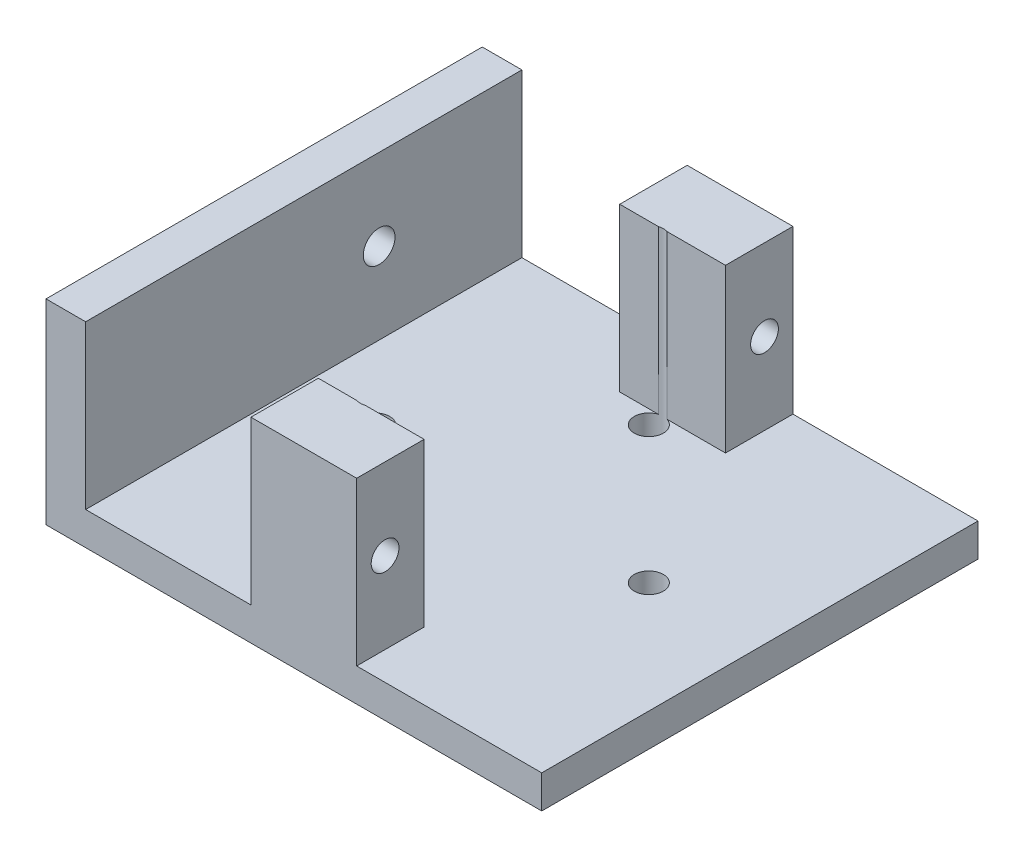
ISO-10303-21;
HEADER;
FILE_DESCRIPTION(('STEP AP214'),'2;1');
FILE_NAME('part.step','',(''),(''),'','','');
FILE_SCHEMA(('AUTOMOTIVE_DESIGN { 1 0 10303 214 1 1 1 1 }'));
ENDSEC;
DATA;
#1=APPLICATION_CONTEXT('core data for automotive mechanical design processes');
#2=APPLICATION_PROTOCOL_DEFINITION('international standard','automotive_design',2000,#1);
#3=PRODUCT_CONTEXT('',#1,'mechanical');
#4=PRODUCT('Part','Part','',(#3));
#5=PRODUCT_RELATED_PRODUCT_CATEGORY('part','',(#4));
#6=PRODUCT_DEFINITION_FORMATION('','',#4);
#7=PRODUCT_DEFINITION_CONTEXT('part definition',#1,'design');
#8=PRODUCT_DEFINITION('design','',#6,#7);
#9=PRODUCT_DEFINITION_SHAPE('','',#8);
#10=(LENGTH_UNIT() NAMED_UNIT(*) SI_UNIT(.MILLI.,.METRE.));
#11=(NAMED_UNIT(*) PLANE_ANGLE_UNIT() SI_UNIT($,.RADIAN.));
#12=(NAMED_UNIT(*) SI_UNIT($,.STERADIAN.) SOLID_ANGLE_UNIT());
#13=UNCERTAINTY_MEASURE_WITH_UNIT(LENGTH_MEASURE(1.E-05),#10,'distance_accuracy_value','');
#14=(GEOMETRIC_REPRESENTATION_CONTEXT(3) GLOBAL_UNCERTAINTY_ASSIGNED_CONTEXT((#13)) GLOBAL_UNIT_ASSIGNED_CONTEXT((#10,
#11,#12)) REPRESENTATION_CONTEXT('',''));
#15=CARTESIAN_POINT('',(0.,0.,0.));
#16=DIRECTION('',(0.,0.,1.));
#17=DIRECTION('',(1.,0.,0.));
#18=AXIS2_PLACEMENT_3D('',#15,#16,#17);
#19=CARTESIAN_POINT('',(4.75000000000001,14.8,11.4));
#20=DIRECTION('',(0.,0.,1.));
#21=DIRECTION('',(1.,0.,0.));
#22=AXIS2_PLACEMENT_3D('',#19,#20,#21);
#23=PLANE('',#22);
#24=DIRECTION('',(-1.,0.,0.));
#25=VECTOR('',#24,1.);
#26=CARTESIAN_POINT('',(4.75000000000001,14.8,11.4));
#27=LINE('',#26,#25);
#28=CARTESIAN_POINT('',(-0.327871926215106,14.8,11.4));
#29=VERTEX_POINT('',#28);
#30=CARTESIAN_POINT('',(-3.24999999999999,14.8,11.4));
#31=VERTEX_POINT('',#30);
#32=EDGE_CURVE('E247',#29,#31,#27,.T.);
#33=ORIENTED_EDGE('',*,*,#32,.F.);
#34=DIRECTION('',(0.,-1.,0.));
#35=VECTOR('',#34,1.);
#36=CARTESIAN_POINT('',(-0.327871926215104,14.8,11.4));
#37=LINE('',#36,#35);
#38=CARTESIAN_POINT('',(-0.327871926215106,2.5,11.4));
#39=VERTEX_POINT('',#38);
#40=EDGE_CURVE('E63',#29,#39,#37,.T.);
#41=ORIENTED_EDGE('',*,*,#40,.T.);
#42=DIRECTION('',(-1.,0.,0.));
#43=VECTOR('',#42,1.);
#44=CARTESIAN_POINT('',(4.75000000000001,2.5,11.4));
#45=LINE('',#44,#43);
#46=CARTESIAN_POINT('',(-3.24999999999999,2.5,11.4));
#47=VERTEX_POINT('',#46);
#48=EDGE_CURVE('E231',#39,#47,#45,.T.);
#49=ORIENTED_EDGE('',*,*,#48,.T.);
#50=DIRECTION('',(0.,-1.,0.));
#51=VECTOR('',#50,1.);
#52=CARTESIAN_POINT('',(-3.24999999999999,14.8,11.4));
#53=LINE('',#52,#51);
#54=EDGE_CURVE('E214',#31,#47,#53,.T.);
#55=ORIENTED_EDGE('',*,*,#54,.F.);
#56=EDGE_LOOP('',(#33,#41,#49,#55));
#57=FACE_BOUND('',#56,.T.);
#58=ADVANCED_FACE('F45',(#57),#23,.F.);
#59=CARTESIAN_POINT('',(4.75000000000001,14.8,-11.4));
#60=DIRECTION('',(0.,0.,-1.));
#61=DIRECTION('',(-1.,0.,0.));
#62=AXIS2_PLACEMENT_3D('',#59,#60,#61);
#63=PLANE('',#62);
#64=DIRECTION('',(1.,0.,0.));
#65=VECTOR('',#64,1.);
#66=CARTESIAN_POINT('',(4.75000000000001,14.8,-11.4));
#67=LINE('',#66,#65);
#68=CARTESIAN_POINT('',(0.32787192621509,14.8,-11.4));
#69=VERTEX_POINT('',#68);
#70=CARTESIAN_POINT('',(4.75000000000001,14.8,-11.4));
#71=VERTEX_POINT('',#70);
#72=EDGE_CURVE('E192',#69,#71,#67,.T.);
#73=ORIENTED_EDGE('',*,*,#72,.F.);
#74=DIRECTION('',(0.,-1.,0.));
#75=VECTOR('',#74,1.);
#76=CARTESIAN_POINT('',(0.327871926215092,14.8,-11.4));
#77=LINE('',#76,#75);
#78=CARTESIAN_POINT('',(0.32787192621509,2.5,-11.4));
#79=VERTEX_POINT('',#78);
#80=EDGE_CURVE('E71',#69,#79,#77,.T.);
#81=ORIENTED_EDGE('',*,*,#80,.T.);
#82=DIRECTION('',(1.,0.,0.));
#83=VECTOR('',#82,1.);
#84=CARTESIAN_POINT('',(4.75000000000001,2.5,-11.4));
#85=LINE('',#84,#83);
#86=CARTESIAN_POINT('',(4.75000000000001,2.5,-11.4));
#87=VERTEX_POINT('',#86);
#88=EDGE_CURVE('E209',#79,#87,#85,.T.);
#89=ORIENTED_EDGE('',*,*,#88,.T.);
#90=DIRECTION('',(0.,-1.,0.));
#91=VECTOR('',#90,1.);
#92=CARTESIAN_POINT('',(4.75000000000001,14.8,-11.4));
#93=LINE('',#92,#91);
#94=EDGE_CURVE('E198',#71,#87,#93,.T.);
#95=ORIENTED_EDGE('',*,*,#94,.F.);
#96=EDGE_LOOP('',(#73,#81,#89,#95));
#97=FACE_BOUND('',#96,.T.);
#98=ADVANCED_FACE('F423',(#97),#63,.F.);
#99=CARTESIAN_POINT('',(0.,2.5,0.));
#100=DIRECTION('',(0.,-1.,0.));
#101=DIRECTION('',(0.,0.,-1.));
#102=AXIS2_PLACEMENT_3D('',#99,#100,#101);
#103=PLANE('',#102);
#104=CARTESIAN_POINT('',(-10.35,2.5,0.));
#105=DIRECTION('',(0.,-1.,0.));
#106=DIRECTION('',(0.,0.,-1.));
#107=AXIS2_PLACEMENT_3D('',#104,#105,#106);
#108=CIRCLE('',#107,1.1);
#109=CARTESIAN_POINT('',(-10.35,2.5,-1.1));
#110=VERTEX_POINT('',#109);
#111=EDGE_CURVE('E381',#110,#110,#108,.T.);
#112=ORIENTED_EDGE('',*,*,#111,.T.);
#113=EDGE_LOOP('',(#112));
#114=FACE_BOUND('',#113,.T.);
#115=CARTESIAN_POINT('',(10.35,2.5,0.));
#116=DIRECTION('',(0.,-1.,0.));
#117=DIRECTION('',(0.,0.,-1.));
#118=AXIS2_PLACEMENT_3D('',#115,#116,#117);
#119=CIRCLE('',#118,1.1);
#120=CARTESIAN_POINT('',(10.35,2.5,-1.1));
#121=VERTEX_POINT('',#120);
#122=EDGE_CURVE('E377',#121,#121,#119,.T.);
#123=ORIENTED_EDGE('',*,*,#122,.T.);
#124=EDGE_LOOP('',(#123));
#125=FACE_BOUND('',#124,.T.);
#126=ORIENTED_EDGE('',*,*,#48,.F.);
#127=CARTESIAN_POINT('',(0.,2.5,10.35));
#128=DIRECTION('',(0.,-1.,0.));
#129=DIRECTION('',(0.,0.,-1.));
#130=AXIS2_PLACEMENT_3D('',#127,#128,#129);
#131=CIRCLE('',#130,1.1);
#132=CARTESIAN_POINT('',(0.327871926215104,2.5,11.4));
#133=VERTEX_POINT('',#132);
#134=EDGE_CURVE('E371',#39,#133,#131,.T.);
#135=ORIENTED_EDGE('',*,*,#134,.T.);
#136=CARTESIAN_POINT('',(4.75000000000001,2.5,11.4));
#137=VERTEX_POINT('',#136);
#138=EDGE_CURVE('E233',#137,#133,#45,.T.);
#139=ORIENTED_EDGE('',*,*,#138,.F.);
#140=DIRECTION('',(0.,0.,-1.));
#141=VECTOR('',#140,1.);
#142=CARTESIAN_POINT('',(4.75000000000001,2.5,16.5));
#143=LINE('',#142,#141);
#144=CARTESIAN_POINT('',(4.75000000000001,2.5,16.5));
#145=VERTEX_POINT('',#144);
#146=EDGE_CURVE('E237',#145,#137,#143,.T.);
#147=ORIENTED_EDGE('',*,*,#146,.F.);
#148=DIRECTION('',(1.,0.,0.));
#149=VECTOR('',#148,1.);
#150=CARTESIAN_POINT('',(-18.75,2.5,16.5));
#151=LINE('',#150,#149);
#152=CARTESIAN_POINT('',(18.75,2.5,16.5));
#153=VERTEX_POINT('',#152);
#154=EDGE_CURVE('E290',#145,#153,#151,.T.);
#155=ORIENTED_EDGE('',*,*,#154,.T.);
#156=DIRECTION('',(0.,0.,-1.));
#157=VECTOR('',#156,1.);
#158=CARTESIAN_POINT('',(18.75,2.5,16.5));
#159=LINE('',#158,#157);
#160=CARTESIAN_POINT('',(18.75,2.5,-16.5));
#161=VERTEX_POINT('',#160);
#162=EDGE_CURVE('E281',#153,#161,#159,.T.);
#163=ORIENTED_EDGE('',*,*,#162,.T.);
#164=DIRECTION('',(-1.,0.,0.));
#165=VECTOR('',#164,1.);
#166=CARTESIAN_POINT('',(-18.75,2.5,-16.5));
#167=LINE('',#166,#165);
#168=CARTESIAN_POINT('',(4.75,2.5,-16.5));
#169=VERTEX_POINT('',#168);
#170=EDGE_CURVE('E287',#161,#169,#167,.T.);
#171=ORIENTED_EDGE('',*,*,#170,.T.);
#172=DIRECTION('',(0.,0.,-1.));
#173=VECTOR('',#172,1.);
#174=CARTESIAN_POINT('',(4.75,2.5,-16.5));
#175=LINE('',#174,#173);
#176=EDGE_CURVE('E200',#87,#169,#175,.T.);
#177=ORIENTED_EDGE('',*,*,#176,.F.);
#178=ORIENTED_EDGE('',*,*,#88,.F.);
#179=CARTESIAN_POINT('',(0.,2.5,-10.35));
#180=DIRECTION('',(0.,-1.,0.));
#181=DIRECTION('',(0.,0.,-1.));
#182=AXIS2_PLACEMENT_3D('',#179,#180,#181);
#183=CIRCLE('',#182,1.1);
#184=CARTESIAN_POINT('',(-0.327871926215093,2.5,-11.4));
#185=VERTEX_POINT('',#184);
#186=EDGE_CURVE('E184',#79,#185,#183,.T.);
#187=ORIENTED_EDGE('',*,*,#186,.T.);
#188=CARTESIAN_POINT('',(-3.25,2.5,-11.4));
#189=VERTEX_POINT('',#188);
#190=EDGE_CURVE('E182',#189,#185,#85,.T.);
#191=ORIENTED_EDGE('',*,*,#190,.F.);
#192=DIRECTION('',(0.,0.,1.));
#193=VECTOR('',#192,1.);
#194=CARTESIAN_POINT('',(-3.25,2.5,-16.5));
#195=LINE('',#194,#193);
#196=CARTESIAN_POINT('',(-3.25,2.5,-16.5));
#197=VERTEX_POINT('',#196);
#198=EDGE_CURVE('E400',#197,#189,#195,.T.);
#199=ORIENTED_EDGE('',*,*,#198,.F.);
#200=CARTESIAN_POINT('',(-15.75,2.5,-16.5));
#201=VERTEX_POINT('',#200);
#202=EDGE_CURVE('E285',#197,#201,#167,.T.);
#203=ORIENTED_EDGE('',*,*,#202,.T.);
#204=DIRECTION('',(0.,0.,-1.));
#205=VECTOR('',#204,1.);
#206=CARTESIAN_POINT('',(-15.75,2.5,-16.5));
#207=LINE('',#206,#205);
#208=CARTESIAN_POINT('',(-15.75,2.5,16.5));
#209=VERTEX_POINT('',#208);
#210=EDGE_CURVE('E241',#209,#201,#207,.T.);
#211=ORIENTED_EDGE('',*,*,#210,.F.);
#212=CARTESIAN_POINT('',(-3.24999999999999,2.5,16.5));
#213=VERTEX_POINT('',#212);
#214=EDGE_CURVE('E291',#209,#213,#151,.T.);
#215=ORIENTED_EDGE('',*,*,#214,.T.);
#216=DIRECTION('',(0.,0.,1.));
#217=VECTOR('',#216,1.);
#218=CARTESIAN_POINT('',(-3.24999999999999,2.5,16.5));
#219=LINE('',#218,#217);
#220=EDGE_CURVE('E227',#47,#213,#219,.T.);
#221=ORIENTED_EDGE('',*,*,#220,.F.);
#222=EDGE_LOOP('',(#126,#135,#139,#147,#155,#163,#171,#177,#178,#187,#191,#199,#203,#211,#215,#221));
#223=FACE_BOUND('',#222,.T.);
#224=ADVANCED_FACE('F416',(#114,#125,#223),#103,.F.);
#225=CARTESIAN_POINT('',(18.75,2.5,16.5));
#226=DIRECTION('',(-1.,0.,0.));
#227=DIRECTION('',(0.,0.,1.));
#228=AXIS2_PLACEMENT_3D('',#225,#226,#227);
#229=PLANE('',#228);
#230=DIRECTION('',(0.,0.,-1.));
#231=VECTOR('',#230,1.);
#232=CARTESIAN_POINT('',(18.75,0.,16.5));
#233=LINE('',#232,#231);
#234=CARTESIAN_POINT('',(18.75,0.,16.5));
#235=VERTEX_POINT('',#234);
#236=CARTESIAN_POINT('',(18.75,0.,-16.5));
#237=VERTEX_POINT('',#236);
#238=EDGE_CURVE('E280',#235,#237,#233,.T.);
#239=ORIENTED_EDGE('',*,*,#238,.T.);
#240=DIRECTION('',(0.,-1.,0.));
#241=VECTOR('',#240,1.);
#242=CARTESIAN_POINT('',(18.75,2.5,-16.5));
#243=LINE('',#242,#241);
#244=EDGE_CURVE('E55',#161,#237,#243,.T.);
#245=ORIENTED_EDGE('',*,*,#244,.F.);
#246=ORIENTED_EDGE('',*,*,#162,.F.);
#247=DIRECTION('',(0.,-1.,0.));
#248=VECTOR('',#247,1.);
#249=CARTESIAN_POINT('',(18.75,2.5,16.5));
#250=LINE('',#249,#248);
#251=EDGE_CURVE('E294',#153,#235,#250,.T.);
#252=ORIENTED_EDGE('',*,*,#251,.T.);
#253=EDGE_LOOP('',(#239,#245,#246,#252));
#254=FACE_BOUND('',#253,.T.);
#255=ADVANCED_FACE('F47',(#254),#229,.F.);
#256=CARTESIAN_POINT('',(-18.75,2.5,-16.5));
#257=DIRECTION('',(0.,0.,1.));
#258=DIRECTION('',(1.,0.,0.));
#259=AXIS2_PLACEMENT_3D('',#256,#257,#258);
#260=PLANE('',#259);
#261=DIRECTION('',(-1.,0.,0.));
#262=VECTOR('',#261,1.);
#263=CARTESIAN_POINT('',(-18.75,0.,-16.5));
#264=LINE('',#263,#262);
#265=CARTESIAN_POINT('',(-18.75,0.,-16.5));
#266=VERTEX_POINT('',#265);
#267=EDGE_CURVE('E298',#237,#266,#264,.T.);
#268=ORIENTED_EDGE('',*,*,#267,.T.);
#269=DIRECTION('',(0.,-1.,0.));
#270=VECTOR('',#269,1.);
#271=CARTESIAN_POINT('',(-18.75,2.5,-16.5));
#272=LINE('',#271,#270);
#273=CARTESIAN_POINT('',(-18.75,14.8,-16.5));
#274=VERTEX_POINT('',#273);
#275=EDGE_CURVE('E313',#274,#266,#272,.T.);
#276=ORIENTED_EDGE('',*,*,#275,.F.);
#277=DIRECTION('',(-1.,0.,0.));
#278=VECTOR('',#277,1.);
#279=CARTESIAN_POINT('',(-18.75,14.8,-16.5));
#280=LINE('',#279,#278);
#281=CARTESIAN_POINT('',(-15.75,14.8,-16.5));
#282=VERTEX_POINT('',#281);
#283=EDGE_CURVE('E265',#282,#274,#280,.T.);
#284=ORIENTED_EDGE('',*,*,#283,.F.);
#285=DIRECTION('',(0.,-1.,0.));
#286=VECTOR('',#285,1.);
#287=CARTESIAN_POINT('',(-15.75,14.8,-16.5));
#288=LINE('',#287,#286);
#289=EDGE_CURVE('E269',#282,#201,#288,.T.);
#290=ORIENTED_EDGE('',*,*,#289,.T.);
#291=ORIENTED_EDGE('',*,*,#202,.F.);
#292=DIRECTION('',(0.,-1.,0.));
#293=VECTOR('',#292,1.);
#294=CARTESIAN_POINT('',(-3.25,14.8,-16.5));
#295=LINE('',#294,#293);
#296=CARTESIAN_POINT('',(-3.25,14.8,-16.5));
#297=VERTEX_POINT('',#296);
#298=EDGE_CURVE('E389',#297,#197,#295,.T.);
#299=ORIENTED_EDGE('',*,*,#298,.F.);
#300=DIRECTION('',(-1.,0.,0.));
#301=VECTOR('',#300,1.);
#302=CARTESIAN_POINT('',(4.75,14.8,-16.5));
#303=LINE('',#302,#301);
#304=CARTESIAN_POINT('',(4.75,14.8,-16.5));
#305=VERTEX_POINT('',#304);
#306=EDGE_CURVE('E196',#305,#297,#303,.T.);
#307=ORIENTED_EDGE('',*,*,#306,.F.);
#308=DIRECTION('',(0.,-1.,0.));
#309=VECTOR('',#308,1.);
#310=CARTESIAN_POINT('',(4.75,14.8,-16.5));
#311=LINE('',#310,#309);
#312=EDGE_CURVE('E385',#305,#169,#311,.T.);
#313=ORIENTED_EDGE('',*,*,#312,.T.);
#314=ORIENTED_EDGE('',*,*,#170,.F.);
#315=ORIENTED_EDGE('',*,*,#244,.T.);
#316=EDGE_LOOP('',(#268,#276,#284,#290,#291,#299,#307,#313,#314,#315));
#317=FACE_BOUND('',#316,.T.);
#318=ADVANCED_FACE('F420',(#317),#260,.F.);
#319=CARTESIAN_POINT('',(-18.75,2.5,16.5));
#320=DIRECTION('',(1.,0.,0.));
#321=DIRECTION('',(0.,0.,-1.));
#322=AXIS2_PLACEMENT_3D('',#319,#320,#321);
#323=PLANE('',#322);
#324=CARTESIAN_POINT('',(-18.75,8.65,-5.7));
#325=DIRECTION('',(1.,0.,0.));
#326=DIRECTION('',(0.,0.,-1.));
#327=AXIS2_PLACEMENT_3D('',#324,#325,#326);
#328=CIRCLE('',#327,1.2);
#329=CARTESIAN_POINT('',(-18.75,8.65,-6.9));
#330=VERTEX_POINT('',#329);
#331=EDGE_CURVE('E338',#330,#330,#328,.T.);
#332=ORIENTED_EDGE('',*,*,#331,.T.);
#333=EDGE_LOOP('',(#332));
#334=FACE_BOUND('',#333,.T.);
#335=DIRECTION('',(0.,0.,1.));
#336=VECTOR('',#335,1.);
#337=CARTESIAN_POINT('',(-18.75,0.,16.5));
#338=LINE('',#337,#336);
#339=CARTESIAN_POINT('',(-18.75,0.,16.5));
#340=VERTEX_POINT('',#339);
#341=EDGE_CURVE('E301',#266,#340,#338,.T.);
#342=ORIENTED_EDGE('',*,*,#341,.T.);
#343=DIRECTION('',(0.,-1.,0.));
#344=VECTOR('',#343,1.);
#345=CARTESIAN_POINT('',(-18.75,2.5,16.5));
#346=LINE('',#345,#344);
#347=CARTESIAN_POINT('',(-18.75,14.8,16.5));
#348=VERTEX_POINT('',#347);
#349=EDGE_CURVE('E309',#348,#340,#346,.T.);
#350=ORIENTED_EDGE('',*,*,#349,.F.);
#351=DIRECTION('',(0.,0.,1.));
#352=VECTOR('',#351,1.);
#353=CARTESIAN_POINT('',(-18.75,14.8,-16.5));
#354=LINE('',#353,#352);
#355=EDGE_CURVE('E255',#274,#348,#354,.T.);
#356=ORIENTED_EDGE('',*,*,#355,.F.);
#357=ORIENTED_EDGE('',*,*,#275,.T.);
#358=EDGE_LOOP('',(#342,#350,#356,#357));
#359=FACE_BOUND('',#358,.T.);
#360=ADVANCED_FACE('F514',(#334,#359),#323,.F.);
#361=CARTESIAN_POINT('',(-18.75,2.5,16.5));
#362=DIRECTION('',(0.,0.,-1.));
#363=DIRECTION('',(-1.,0.,0.));
#364=AXIS2_PLACEMENT_3D('',#361,#362,#363);
#365=PLANE('',#364);
#366=DIRECTION('',(1.,0.,0.));
#367=VECTOR('',#366,1.);
#368=CARTESIAN_POINT('',(-18.75,0.,16.5));
#369=LINE('',#368,#367);
#370=EDGE_CURVE('E286',#340,#235,#369,.T.);
#371=ORIENTED_EDGE('',*,*,#370,.T.);
#372=ORIENTED_EDGE('',*,*,#251,.F.);
#373=ORIENTED_EDGE('',*,*,#154,.F.);
#374=DIRECTION('',(0.,-1.,0.));
#375=VECTOR('',#374,1.);
#376=CARTESIAN_POINT('',(4.75000000000001,14.8,16.5));
#377=LINE('',#376,#375);
#378=CARTESIAN_POINT('',(4.75000000000001,14.8,16.5));
#379=VERTEX_POINT('',#378);
#380=EDGE_CURVE('E222',#379,#145,#377,.T.);
#381=ORIENTED_EDGE('',*,*,#380,.F.);
#382=DIRECTION('',(1.,0.,0.));
#383=VECTOR('',#382,1.);
#384=CARTESIAN_POINT('',(4.75000000000001,14.8,16.5));
#385=LINE('',#384,#383);
#386=CARTESIAN_POINT('',(-3.24999999999999,14.8,16.5));
#387=VERTEX_POINT('',#386);
#388=EDGE_CURVE('E226',#387,#379,#385,.T.);
#389=ORIENTED_EDGE('',*,*,#388,.F.);
#390=DIRECTION('',(0.,-1.,0.));
#391=VECTOR('',#390,1.);
#392=CARTESIAN_POINT('',(-3.24999999999999,14.8,16.5));
#393=LINE('',#392,#391);
#394=EDGE_CURVE('E218',#387,#213,#393,.T.);
#395=ORIENTED_EDGE('',*,*,#394,.T.);
#396=ORIENTED_EDGE('',*,*,#214,.F.);
#397=DIRECTION('',(0.,-1.,0.));
#398=VECTOR('',#397,1.);
#399=CARTESIAN_POINT('',(-15.75,14.8,16.5));
#400=LINE('',#399,#398);
#401=CARTESIAN_POINT('',(-15.75,14.8,16.5));
#402=VERTEX_POINT('',#401);
#403=EDGE_CURVE('E276',#402,#209,#400,.T.);
#404=ORIENTED_EDGE('',*,*,#403,.F.);
#405=DIRECTION('',(1.,0.,0.));
#406=VECTOR('',#405,1.);
#407=CARTESIAN_POINT('',(-18.75,14.8,16.5));
#408=LINE('',#407,#406);
#409=EDGE_CURVE('E259',#348,#402,#408,.T.);
#410=ORIENTED_EDGE('',*,*,#409,.F.);
#411=ORIENTED_EDGE('',*,*,#349,.T.);
#412=EDGE_LOOP('',(#371,#372,#373,#381,#389,#395,#396,#404,#410,#411));
#413=FACE_BOUND('',#412,.T.);
#414=ADVANCED_FACE('F493',(#413),#365,.F.);
#415=CARTESIAN_POINT('',(0.,0.,0.));
#416=DIRECTION('',(0.,-1.,0.));
#417=DIRECTION('',(0.,0.,-1.));
#418=AXIS2_PLACEMENT_3D('',#415,#416,#417);
#419=PLANE('',#418);
#420=CARTESIAN_POINT('',(-10.35,0.,0.));
#421=DIRECTION('',(0.,-1.,0.));
#422=DIRECTION('',(0.,0.,-1.));
#423=AXIS2_PLACEMENT_3D('',#420,#421,#422);
#424=CIRCLE('',#423,1.1);
#425=CARTESIAN_POINT('',(-10.35,0.,-1.1));
#426=VERTEX_POINT('',#425);
#427=EDGE_CURVE('E185',#426,#426,#424,.T.);
#428=ORIENTED_EDGE('',*,*,#427,.F.);
#429=EDGE_LOOP('',(#428));
#430=FACE_BOUND('',#429,.T.);
#431=CARTESIAN_POINT('',(0.,0.,10.35));
#432=DIRECTION('',(0.,-1.,0.));
#433=DIRECTION('',(0.,0.,-1.));
#434=AXIS2_PLACEMENT_3D('',#431,#432,#433);
#435=CIRCLE('',#434,1.1);
#436=CARTESIAN_POINT('',(0.,0.,9.25));
#437=VERTEX_POINT('',#436);
#438=EDGE_CURVE('E352',#437,#437,#435,.T.);
#439=ORIENTED_EDGE('',*,*,#438,.F.);
#440=EDGE_LOOP('',(#439));
#441=FACE_BOUND('',#440,.T.);
#442=CARTESIAN_POINT('',(10.35,0.,0.));
#443=DIRECTION('',(0.,-1.,0.));
#444=DIRECTION('',(0.,0.,-1.));
#445=AXIS2_PLACEMENT_3D('',#442,#443,#444);
#446=CIRCLE('',#445,1.1);
#447=CARTESIAN_POINT('',(10.35,0.,-1.1));
#448=VERTEX_POINT('',#447);
#449=EDGE_CURVE('E356',#448,#448,#446,.T.);
#450=ORIENTED_EDGE('',*,*,#449,.F.);
#451=EDGE_LOOP('',(#450));
#452=FACE_BOUND('',#451,.T.);
#453=CARTESIAN_POINT('',(0.,0.,-10.35));
#454=DIRECTION('',(0.,-1.,0.));
#455=DIRECTION('',(0.,0.,-1.));
#456=AXIS2_PLACEMENT_3D('',#453,#454,#455);
#457=CIRCLE('',#456,1.1);
#458=CARTESIAN_POINT('',(0.,0.,-11.45));
#459=VERTEX_POINT('',#458);
#460=EDGE_CURVE('E342',#459,#459,#457,.T.);
#461=ORIENTED_EDGE('',*,*,#460,.F.);
#462=EDGE_LOOP('',(#461));
#463=FACE_BOUND('',#462,.T.);
#464=ORIENTED_EDGE('',*,*,#238,.F.);
#465=ORIENTED_EDGE('',*,*,#370,.F.);
#466=ORIENTED_EDGE('',*,*,#341,.F.);
#467=ORIENTED_EDGE('',*,*,#267,.F.);
#468=EDGE_LOOP('',(#464,#465,#466,#467));
#469=FACE_BOUND('',#468,.T.);
#470=ADVANCED_FACE('F515',(#430,#441,#452,#463,#469),#419,.T.);
#471=CARTESIAN_POINT('',(-15.75,14.8,-16.5));
#472=DIRECTION('',(-1.,0.,0.));
#473=DIRECTION('',(0.,0.,1.));
#474=AXIS2_PLACEMENT_3D('',#471,#472,#473);
#475=PLANE('',#474);
#476=CARTESIAN_POINT('',(-15.75,8.65,-5.7));
#477=DIRECTION('',(1.,0.,0.));
#478=DIRECTION('',(0.,0.,-1.));
#479=AXIS2_PLACEMENT_3D('',#476,#477,#478);
#480=CIRCLE('',#479,1.2);
#481=CARTESIAN_POINT('',(-15.75,8.65,-6.9));
#482=VERTEX_POINT('',#481);
#483=EDGE_CURVE('E328',#482,#482,#480,.T.);
#484=ORIENTED_EDGE('',*,*,#483,.F.);
#485=EDGE_LOOP('',(#484));
#486=FACE_BOUND('',#485,.T.);
#487=ORIENTED_EDGE('',*,*,#210,.T.);
#488=ORIENTED_EDGE('',*,*,#289,.F.);
#489=DIRECTION('',(0.,0.,-1.));
#490=VECTOR('',#489,1.);
#491=CARTESIAN_POINT('',(-15.75,14.8,-16.5));
#492=LINE('',#491,#490);
#493=EDGE_CURVE('E262',#402,#282,#492,.T.);
#494=ORIENTED_EDGE('',*,*,#493,.F.);
#495=ORIENTED_EDGE('',*,*,#403,.T.);
#496=EDGE_LOOP('',(#487,#488,#494,#495));
#497=FACE_BOUND('',#496,.T.);
#498=ADVANCED_FACE('F517',(#486,#497),#475,.F.);
#499=CARTESIAN_POINT('',(0.,14.8,0.));
#500=DIRECTION('',(0.,1.,0.));
#501=DIRECTION('',(0.,0.,1.));
#502=AXIS2_PLACEMENT_3D('',#499,#500,#501);
#503=PLANE('',#502);
#504=ORIENTED_EDGE('',*,*,#355,.T.);
#505=ORIENTED_EDGE('',*,*,#409,.T.);
#506=ORIENTED_EDGE('',*,*,#493,.T.);
#507=ORIENTED_EDGE('',*,*,#283,.T.);
#508=EDGE_LOOP('',(#504,#505,#506,#507));
#509=FACE_BOUND('',#508,.T.);
#510=ADVANCED_FACE('F524',(#509),#503,.T.);
#511=CARTESIAN_POINT('',(4.75000000000001,14.8,16.5));
#512=DIRECTION('',(-1.,0.,0.));
#513=DIRECTION('',(0.,0.,1.));
#514=AXIS2_PLACEMENT_3D('',#511,#512,#513);
#515=PLANE('',#514);
#516=CARTESIAN_POINT('',(4.75000000000001,8.65,14.35));
#517=DIRECTION('',(1.,0.,0.));
#518=DIRECTION('',(0.,0.,-1.));
#519=AXIS2_PLACEMENT_3D('',#516,#517,#518);
#520=CIRCLE('',#519,1.05);
#521=CARTESIAN_POINT('',(4.75000000000001,8.65,13.3));
#522=VERTEX_POINT('',#521);
#523=EDGE_CURVE('E322',#522,#522,#520,.T.);
#524=ORIENTED_EDGE('',*,*,#523,.F.);
#525=EDGE_LOOP('',(#524));
#526=FACE_BOUND('',#525,.T.);
#527=ORIENTED_EDGE('',*,*,#146,.T.);
#528=DIRECTION('',(0.,-1.,0.));
#529=VECTOR('',#528,1.);
#530=CARTESIAN_POINT('',(4.75000000000001,14.8,11.4));
#531=LINE('',#530,#529);
#532=CARTESIAN_POINT('',(4.75000000000001,14.8,11.4));
#533=VERTEX_POINT('',#532);
#534=EDGE_CURVE('E210',#533,#137,#531,.T.);
#535=ORIENTED_EDGE('',*,*,#534,.F.);
#536=DIRECTION('',(0.,0.,-1.));
#537=VECTOR('',#536,1.);
#538=CARTESIAN_POINT('',(4.75000000000001,14.8,16.5));
#539=LINE('',#538,#537);
#540=EDGE_CURVE('E232',#379,#533,#539,.T.);
#541=ORIENTED_EDGE('',*,*,#540,.F.);
#542=ORIENTED_EDGE('',*,*,#380,.T.);
#543=EDGE_LOOP('',(#527,#535,#541,#542));
#544=FACE_BOUND('',#543,.T.);
#545=ADVANCED_FACE('F589',(#526,#544),#515,.F.);
#546=ORIENTED_EDGE('',*,*,#138,.T.);
#547=DIRECTION('',(0.,-1.,0.));
#548=VECTOR('',#547,1.);
#549=CARTESIAN_POINT('',(0.327871926215104,14.8,11.4));
#550=LINE('',#549,#548);
#551=CARTESIAN_POINT('',(0.327871926215106,14.8,11.4));
#552=VERTEX_POINT('',#551);
#553=EDGE_CURVE('E367',#133,#552,#550,.F.);
#554=ORIENTED_EDGE('',*,*,#553,.T.);
#555=EDGE_CURVE('E248',#533,#552,#27,.T.);
#556=ORIENTED_EDGE('',*,*,#555,.F.);
#557=ORIENTED_EDGE('',*,*,#534,.T.);
#558=EDGE_LOOP('',(#546,#554,#556,#557));
#559=FACE_BOUND('',#558,.T.);
#560=ADVANCED_FACE('F435',(#559),#23,.F.);
#561=CARTESIAN_POINT('',(-3.24999999999999,14.8,16.5));
#562=DIRECTION('',(1.,0.,0.));
#563=DIRECTION('',(0.,0.,-1.));
#564=AXIS2_PLACEMENT_3D('',#561,#562,#563);
#565=PLANE('',#564);
#566=CARTESIAN_POINT('',(-3.24999999999999,8.65,14.35));
#567=DIRECTION('',(1.,0.,0.));
#568=DIRECTION('',(0.,0.,-1.));
#569=AXIS2_PLACEMENT_3D('',#566,#567,#568);
#570=CIRCLE('',#569,1.05);
#571=CARTESIAN_POINT('',(-3.24999999999999,8.65,13.3));
#572=VERTEX_POINT('',#571);
#573=EDGE_CURVE('E49',#572,#572,#570,.T.);
#574=ORIENTED_EDGE('',*,*,#573,.T.);
#575=EDGE_LOOP('',(#574));
#576=FACE_BOUND('',#575,.T.);
#577=ORIENTED_EDGE('',*,*,#220,.T.);
#578=ORIENTED_EDGE('',*,*,#394,.F.);
#579=DIRECTION('',(0.,0.,1.));
#580=VECTOR('',#579,1.);
#581=CARTESIAN_POINT('',(-3.24999999999999,14.8,16.5));
#582=LINE('',#581,#580);
#583=EDGE_CURVE('E244',#31,#387,#582,.T.);
#584=ORIENTED_EDGE('',*,*,#583,.F.);
#585=ORIENTED_EDGE('',*,*,#54,.T.);
#586=EDGE_LOOP('',(#577,#578,#584,#585));
#587=FACE_BOUND('',#586,.T.);
#588=ADVANCED_FACE('F482',(#576,#587),#565,.F.);
#589=CARTESIAN_POINT('',(0.,14.8,0.));
#590=DIRECTION('',(0.,1.,0.));
#591=DIRECTION('',(0.,0.,1.));
#592=AXIS2_PLACEMENT_3D('',#589,#590,#591);
#593=PLANE('',#592);
#594=CARTESIAN_POINT('',(0.,14.8,10.35));
#595=DIRECTION('',(0.,-1.,0.));
#596=DIRECTION('',(0.,0.,-1.));
#597=AXIS2_PLACEMENT_3D('',#594,#595,#596);
#598=CIRCLE('',#597,1.1);
#599=EDGE_CURVE('E349',#552,#29,#598,.T.);
#600=ORIENTED_EDGE('',*,*,#599,.T.);
#601=ORIENTED_EDGE('',*,*,#32,.T.);
#602=ORIENTED_EDGE('',*,*,#583,.T.);
#603=ORIENTED_EDGE('',*,*,#388,.T.);
#604=ORIENTED_EDGE('',*,*,#540,.T.);
#605=ORIENTED_EDGE('',*,*,#555,.T.);
#606=EDGE_LOOP('',(#600,#601,#602,#603,#604,#605));
#607=FACE_BOUND('',#606,.T.);
#608=ADVANCED_FACE('F449',(#607),#593,.T.);
#609=CARTESIAN_POINT('',(4.75,14.8,-16.5));
#610=DIRECTION('',(-1.,0.,0.));
#611=DIRECTION('',(0.,0.,1.));
#612=AXIS2_PLACEMENT_3D('',#609,#610,#611);
#613=PLANE('',#612);
#614=CARTESIAN_POINT('',(4.75,8.65000000000001,-14.35));
#615=DIRECTION('',(1.,0.,0.));
#616=DIRECTION('',(0.,0.,-1.));
#617=AXIS2_PLACEMENT_3D('',#614,#615,#616);
#618=CIRCLE('',#617,1.05);
#619=CARTESIAN_POINT('',(4.75,8.65000000000001,-15.4));
#620=VERTEX_POINT('',#619);
#621=EDGE_CURVE('E330',#620,#620,#618,.T.);
#622=ORIENTED_EDGE('',*,*,#621,.F.);
#623=EDGE_LOOP('',(#622));
#624=FACE_BOUND('',#623,.T.);
#625=ORIENTED_EDGE('',*,*,#176,.T.);
#626=ORIENTED_EDGE('',*,*,#312,.F.);
#627=DIRECTION('',(0.,0.,-1.));
#628=VECTOR('',#627,1.);
#629=CARTESIAN_POINT('',(4.75,14.8,-16.5));
#630=LINE('',#629,#628);
#631=EDGE_CURVE('E205',#71,#305,#630,.T.);
#632=ORIENTED_EDGE('',*,*,#631,.F.);
#633=ORIENTED_EDGE('',*,*,#94,.T.);
#634=EDGE_LOOP('',(#625,#626,#632,#633));
#635=FACE_BOUND('',#634,.T.);
#636=ADVANCED_FACE('F410',(#624,#635),#613,.F.);
#637=CARTESIAN_POINT('',(-3.25,14.8,-16.5));
#638=DIRECTION('',(1.,0.,0.));
#639=DIRECTION('',(0.,0.,-1.));
#640=AXIS2_PLACEMENT_3D('',#637,#638,#639);
#641=PLANE('',#640);
#642=CARTESIAN_POINT('',(-3.25,8.65000000000001,-14.35));
#643=DIRECTION('',(1.,0.,0.));
#644=DIRECTION('',(0.,0.,-1.));
#645=AXIS2_PLACEMENT_3D('',#642,#643,#644);
#646=CIRCLE('',#645,1.05);
#647=CARTESIAN_POINT('',(-3.25,8.65000000000001,-15.4));
#648=VERTEX_POINT('',#647);
#649=EDGE_CURVE('E319',#648,#648,#646,.T.);
#650=ORIENTED_EDGE('',*,*,#649,.T.);
#651=EDGE_LOOP('',(#650));
#652=FACE_BOUND('',#651,.T.);
#653=ORIENTED_EDGE('',*,*,#198,.T.);
#654=DIRECTION('',(0.,-1.,0.));
#655=VECTOR('',#654,1.);
#656=CARTESIAN_POINT('',(-3.25,14.8,-11.4));
#657=LINE('',#656,#655);
#658=CARTESIAN_POINT('',(-3.25,14.8,-11.4));
#659=VERTEX_POINT('',#658);
#660=EDGE_CURVE('E393',#659,#189,#657,.T.);
#661=ORIENTED_EDGE('',*,*,#660,.F.);
#662=DIRECTION('',(0.,0.,1.));
#663=VECTOR('',#662,1.);
#664=CARTESIAN_POINT('',(-3.25,14.8,-16.5));
#665=LINE('',#664,#663);
#666=EDGE_CURVE('E189',#297,#659,#665,.T.);
#667=ORIENTED_EDGE('',*,*,#666,.F.);
#668=ORIENTED_EDGE('',*,*,#298,.T.);
#669=EDGE_LOOP('',(#653,#661,#667,#668));
#670=FACE_BOUND('',#669,.T.);
#671=ADVANCED_FACE('F439',(#652,#670),#641,.F.);
#672=ORIENTED_EDGE('',*,*,#190,.T.);
#673=DIRECTION('',(0.,-1.,0.));
#674=VECTOR('',#673,1.);
#675=CARTESIAN_POINT('',(-0.327871926215093,14.8,-11.4));
#676=LINE('',#675,#674);
#677=CARTESIAN_POINT('',(-0.327871926215091,14.8,-11.4));
#678=VERTEX_POINT('',#677);
#679=EDGE_CURVE('E171',#185,#678,#676,.F.);
#680=ORIENTED_EDGE('',*,*,#679,.T.);
#681=EDGE_CURVE('E181',#659,#678,#67,.T.);
#682=ORIENTED_EDGE('',*,*,#681,.F.);
#683=ORIENTED_EDGE('',*,*,#660,.T.);
#684=EDGE_LOOP('',(#672,#680,#682,#683));
#685=FACE_BOUND('',#684,.T.);
#686=ADVANCED_FACE('F179',(#685),#63,.F.);
#687=CARTESIAN_POINT('',(0.,14.8,0.));
#688=DIRECTION('',(0.,-1.,0.));
#689=DIRECTION('',(0.,0.,-1.));
#690=AXIS2_PLACEMENT_3D('',#687,#688,#689);
#691=PLANE('',#690);
#692=ORIENTED_EDGE('',*,*,#681,.T.);
#693=CARTESIAN_POINT('',(0.,14.8,-10.35));
#694=DIRECTION('',(0.,-1.,0.));
#695=DIRECTION('',(0.,0.,-1.));
#696=AXIS2_PLACEMENT_3D('',#693,#694,#695);
#697=CIRCLE('',#696,1.1);
#698=EDGE_CURVE('E11',#678,#69,#697,.T.);
#699=ORIENTED_EDGE('',*,*,#698,.T.);
#700=ORIENTED_EDGE('',*,*,#72,.T.);
#701=ORIENTED_EDGE('',*,*,#631,.T.);
#702=ORIENTED_EDGE('',*,*,#306,.T.);
#703=ORIENTED_EDGE('',*,*,#666,.T.);
#704=EDGE_LOOP('',(#692,#699,#700,#701,#702,#703));
#705=FACE_BOUND('',#704,.T.);
#706=ADVANCED_FACE('F187',(#705),#691,.F.);
#707=CARTESIAN_POINT('',(0.,14.8,-10.35));
#708=DIRECTION('',(0.,-1.,0.));
#709=DIRECTION('',(0.,0.,-1.));
#710=AXIS2_PLACEMENT_3D('',#707,#708,#709);
#711=CYLINDRICAL_SURFACE('',#710,1.1);
#712=ORIENTED_EDGE('',*,*,#460,.T.);
#713=EDGE_LOOP('',(#712));
#714=FACE_BOUND('',#713,.T.);
#715=ORIENTED_EDGE('',*,*,#698,.F.);
#716=ORIENTED_EDGE('',*,*,#679,.F.);
#717=ORIENTED_EDGE('',*,*,#186,.F.);
#718=ORIENTED_EDGE('',*,*,#80,.F.);
#719=EDGE_LOOP('',(#715,#716,#717,#718));
#720=FACE_BOUND('',#719,.T.);
#721=ADVANCED_FACE('F170',(#714,#720),#711,.F.);
#722=CARTESIAN_POINT('',(0.,14.8,10.35));
#723=DIRECTION('',(0.,-1.,0.));
#724=DIRECTION('',(0.,0.,-1.));
#725=AXIS2_PLACEMENT_3D('',#722,#723,#724);
#726=CYLINDRICAL_SURFACE('',#725,1.1);
#727=ORIENTED_EDGE('',*,*,#438,.T.);
#728=EDGE_LOOP('',(#727));
#729=FACE_BOUND('',#728,.T.);
#730=ORIENTED_EDGE('',*,*,#599,.F.);
#731=ORIENTED_EDGE('',*,*,#553,.F.);
#732=ORIENTED_EDGE('',*,*,#134,.F.);
#733=ORIENTED_EDGE('',*,*,#40,.F.);
#734=EDGE_LOOP('',(#730,#731,#732,#733));
#735=FACE_BOUND('',#734,.T.);
#736=ADVANCED_FACE('F455',(#729,#735),#726,.F.);
#737=CARTESIAN_POINT('',(10.35,14.8,0.));
#738=DIRECTION('',(0.,-1.,0.));
#739=DIRECTION('',(0.,0.,-1.));
#740=AXIS2_PLACEMENT_3D('',#737,#738,#739);
#741=CYLINDRICAL_SURFACE('',#740,1.1);
#742=ORIENTED_EDGE('',*,*,#449,.T.);
#743=EDGE_LOOP('',(#742));
#744=FACE_BOUND('',#743,.T.);
#745=ORIENTED_EDGE('',*,*,#122,.F.);
#746=EDGE_LOOP('',(#745));
#747=FACE_BOUND('',#746,.T.);
#748=ADVANCED_FACE('F457',(#744,#747),#741,.F.);
#749=CARTESIAN_POINT('',(-10.35,14.8,0.));
#750=DIRECTION('',(0.,-1.,0.));
#751=DIRECTION('',(0.,0.,-1.));
#752=AXIS2_PLACEMENT_3D('',#749,#750,#751);
#753=CYLINDRICAL_SURFACE('',#752,1.1);
#754=ORIENTED_EDGE('',*,*,#427,.T.);
#755=EDGE_LOOP('',(#754));
#756=FACE_BOUND('',#755,.T.);
#757=ORIENTED_EDGE('',*,*,#111,.F.);
#758=EDGE_LOOP('',(#757));
#759=FACE_BOUND('',#758,.T.);
#760=ADVANCED_FACE('F460',(#756,#759),#753,.F.);
#761=CARTESIAN_POINT('',(-18.75,8.65,-5.7));
#762=DIRECTION('',(1.,0.,0.));
#763=DIRECTION('',(0.,0.,-1.));
#764=AXIS2_PLACEMENT_3D('',#761,#762,#763);
#765=CYLINDRICAL_SURFACE('',#764,1.2);
#766=ORIENTED_EDGE('',*,*,#331,.F.);
#767=EDGE_LOOP('',(#766));
#768=FACE_BOUND('',#767,.T.);
#769=ORIENTED_EDGE('',*,*,#483,.T.);
#770=EDGE_LOOP('',(#769));
#771=FACE_BOUND('',#770,.T.);
#772=ADVANCED_FACE('F467',(#768,#771),#765,.F.);
#773=CARTESIAN_POINT('',(-5.25,8.65000000000001,-14.35));
#774=DIRECTION('',(1.,0.,0.));
#775=DIRECTION('',(0.,0.,-1.));
#776=AXIS2_PLACEMENT_3D('',#773,#774,#775);
#777=CYLINDRICAL_SURFACE('',#776,1.05);
#778=ORIENTED_EDGE('',*,*,#621,.T.);
#779=EDGE_LOOP('',(#778));
#780=FACE_BOUND('',#779,.T.);
#781=ORIENTED_EDGE('',*,*,#649,.F.);
#782=EDGE_LOOP('',(#781));
#783=FACE_BOUND('',#782,.T.);
#784=ADVANCED_FACE('F471',(#780,#783),#777,.F.);
#785=CARTESIAN_POINT('',(-5.24999999999999,8.65,14.35));
#786=DIRECTION('',(1.,0.,0.));
#787=DIRECTION('',(0.,0.,-1.));
#788=AXIS2_PLACEMENT_3D('',#785,#786,#787);
#789=CYLINDRICAL_SURFACE('',#788,1.05);
#790=ORIENTED_EDGE('',*,*,#523,.T.);
#791=EDGE_LOOP('',(#790));
#792=FACE_BOUND('',#791,.T.);
#793=ORIENTED_EDGE('',*,*,#573,.F.);
#794=EDGE_LOOP('',(#793));
#795=FACE_BOUND('',#794,.T.);
#796=ADVANCED_FACE('F474',(#792,#795),#789,.F.);
#797=CLOSED_SHELL('',(#58,#98,#224,#255,#318,#360,#414,#470,#498,#510,#545,#560,#588,#608,#636,
#671,#686,#706,#721,#736,#748,#760,#772,#784,#796));
#798=MANIFOLD_SOLID_BREP('B2',#797);
#799=ADVANCED_BREP_SHAPE_REPRESENTATION('',(#18,#798),#14);
#800=SHAPE_DEFINITION_REPRESENTATION(#9,#799);
ENDSEC;
END-ISO-10303-21;
